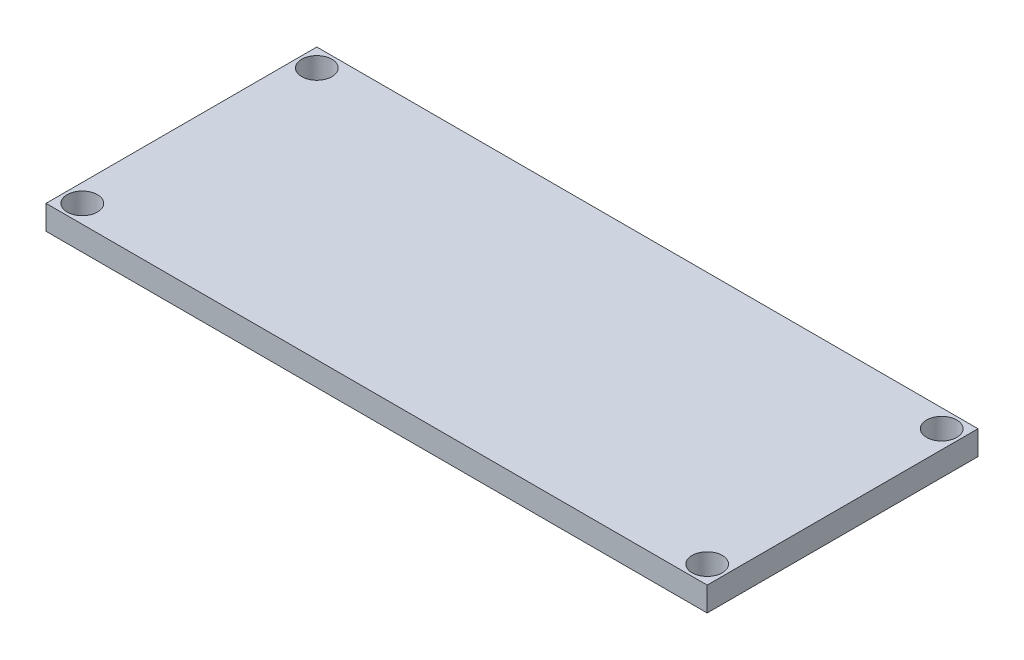
ISO-10303-21;
HEADER;
FILE_DESCRIPTION(('STEP AP214'),'2;1');
FILE_NAME('part.step','',(''),(''),'','','');
FILE_SCHEMA(('AUTOMOTIVE_DESIGN { 1 0 10303 214 1 1 1 1 }'));
ENDSEC;
DATA;
#1=APPLICATION_CONTEXT('core data for automotive mechanical design processes');
#2=APPLICATION_PROTOCOL_DEFINITION('international standard','automotive_design',2000,#1);
#3=PRODUCT_CONTEXT('',#1,'mechanical');
#4=PRODUCT('Part','Part','',(#3));
#5=PRODUCT_RELATED_PRODUCT_CATEGORY('part','',(#4));
#6=PRODUCT_DEFINITION_FORMATION('','',#4);
#7=PRODUCT_DEFINITION_CONTEXT('part definition',#1,'design');
#8=PRODUCT_DEFINITION('design','',#6,#7);
#9=PRODUCT_DEFINITION_SHAPE('','',#8);
#10=(LENGTH_UNIT() NAMED_UNIT(*) SI_UNIT(.MILLI.,.METRE.));
#11=(NAMED_UNIT(*) PLANE_ANGLE_UNIT() SI_UNIT($,.RADIAN.));
#12=(NAMED_UNIT(*) SI_UNIT($,.STERADIAN.) SOLID_ANGLE_UNIT());
#13=UNCERTAINTY_MEASURE_WITH_UNIT(LENGTH_MEASURE(1.E-05),#10,'distance_accuracy_value','');
#14=(GEOMETRIC_REPRESENTATION_CONTEXT(3) GLOBAL_UNCERTAINTY_ASSIGNED_CONTEXT((#13)) GLOBAL_UNIT_ASSIGNED_CONTEXT((#10,
#11,#12)) REPRESENTATION_CONTEXT('',''));
#15=CARTESIAN_POINT('',(0.,0.,0.));
#16=DIRECTION('',(0.,0.,1.));
#17=DIRECTION('',(1.,0.,0.));
#18=AXIS2_PLACEMENT_3D('',#15,#16,#17);
#19=CARTESIAN_POINT('',(21.85,0.,8.95));
#20=DIRECTION('',(0.,1.,0.));
#21=DIRECTION('',(0.,0.,1.));
#22=AXIS2_PLACEMENT_3D('',#19,#20,#21);
#23=PLANE('',#22);
#24=CARTESIAN_POINT('',(1.2,0.,16.7));
#25=DIRECTION('',(0.,1.,0.));
#26=DIRECTION('',(-1.,0.,0.));
#27=AXIS2_PLACEMENT_3D('',#24,#25,#26);
#28=CIRCLE('',#27,0.999999999999996);
#29=CARTESIAN_POINT('',(0.200000000000004,0.,16.7));
#30=VERTEX_POINT('',#29);
#31=EDGE_CURVE('E90',#30,#30,#28,.T.);
#32=ORIENTED_EDGE('',*,*,#31,.T.);
#33=EDGE_LOOP('',(#32));
#34=FACE_BOUND('',#33,.T.);
#35=CARTESIAN_POINT('',(42.5,0.,1.2));
#36=DIRECTION('',(0.,1.,0.));
#37=DIRECTION('',(0.,0.,1.));
#38=AXIS2_PLACEMENT_3D('',#35,#36,#37);
#39=CIRCLE('',#38,0.999999999999996);
#40=CARTESIAN_POINT('',(42.5,0.,2.2));
#41=VERTEX_POINT('',#40);
#42=EDGE_CURVE('E94',#41,#41,#39,.T.);
#43=ORIENTED_EDGE('',*,*,#42,.T.);
#44=EDGE_LOOP('',(#43));
#45=FACE_BOUND('',#44,.T.);
#46=CARTESIAN_POINT('',(42.5,0.,16.7));
#47=DIRECTION('',(0.,-1.,0.));
#48=DIRECTION('',(0.,0.,-1.));
#49=AXIS2_PLACEMENT_3D('',#46,#47,#48);
#50=CIRCLE('',#49,0.999999999999996);
#51=CARTESIAN_POINT('',(42.5,0.,15.7));
#52=VERTEX_POINT('',#51);
#53=EDGE_CURVE('E96',#52,#52,#50,.F.);
#54=ORIENTED_EDGE('',*,*,#53,.T.);
#55=EDGE_LOOP('',(#54));
#56=FACE_BOUND('',#55,.T.);
#57=CARTESIAN_POINT('',(1.2,0.,1.2));
#58=DIRECTION('',(0.,-1.,0.));
#59=DIRECTION('',(1.,0.,0.));
#60=AXIS2_PLACEMENT_3D('',#57,#58,#59);
#61=CIRCLE('',#60,0.999999999999996);
#62=CARTESIAN_POINT('',(2.2,0.,1.2));
#63=VERTEX_POINT('',#62);
#64=EDGE_CURVE('E19',#63,#63,#61,.F.);
#65=ORIENTED_EDGE('',*,*,#64,.T.);
#66=EDGE_LOOP('',(#65));
#67=FACE_BOUND('',#66,.T.);
#68=DIRECTION('',(0.,0.,1.));
#69=VECTOR('',#68,1.);
#70=CARTESIAN_POINT('',(0.,0.,0.));
#71=LINE('',#70,#69);
#72=CARTESIAN_POINT('',(0.,-3.46109497215618E-13,0.));
#73=VERTEX_POINT('',#72);
#74=CARTESIAN_POINT('',(0.,-3.46109497215618E-13,17.9));
#75=VERTEX_POINT('',#74);
#76=EDGE_CURVE('E105',#73,#75,#71,.T.);
#77=ORIENTED_EDGE('',*,*,#76,.F.);
#78=DIRECTION('',(-1.,0.,0.));
#79=VECTOR('',#78,1.);
#80=CARTESIAN_POINT('',(43.7,-1.38443798886247E-12,0.));
#81=LINE('',#80,#79);
#82=CARTESIAN_POINT('',(43.7,-6.92218994431235E-13,0.));
#83=VERTEX_POINT('',#82);
#84=EDGE_CURVE('E54',#83,#73,#81,.T.);
#85=ORIENTED_EDGE('',*,*,#84,.F.);
#86=DIRECTION('',(0.,0.,-1.));
#87=VECTOR('',#86,1.);
#88=CARTESIAN_POINT('',(43.7,-1.38443798886247E-12,17.9));
#89=LINE('',#88,#87);
#90=CARTESIAN_POINT('',(43.7,-6.92218994431235E-13,17.9));
#91=VERTEX_POINT('',#90);
#92=EDGE_CURVE('E56',#91,#83,#89,.T.);
#93=ORIENTED_EDGE('',*,*,#92,.F.);
#94=DIRECTION('',(1.,0.,0.));
#95=VECTOR('',#94,1.);
#96=CARTESIAN_POINT('',(0.,-1.38443798886247E-12,17.9));
#97=LINE('',#96,#95);
#98=EDGE_CURVE('E58',#75,#91,#97,.T.);
#99=ORIENTED_EDGE('',*,*,#98,.F.);
#100=EDGE_LOOP('',(#77,#85,#93,#99));
#101=FACE_BOUND('',#100,.T.);
#102=ADVANCED_FACE('F16',(#34,#45,#56,#67,#101),#23,.F.);
#103=CARTESIAN_POINT('',(0.,-1.38443798886247E-12,17.9));
#104=DIRECTION('',(0.,0.,1.));
#105=DIRECTION('',(1.,0.,0.));
#106=AXIS2_PLACEMENT_3D('',#103,#104,#105);
#107=PLANE('',#106);
#108=DIRECTION('',(1.,0.,0.));
#109=VECTOR('',#108,1.);
#110=CARTESIAN_POINT('',(21.85,1.6,17.9));
#111=LINE('',#110,#109);
#112=CARTESIAN_POINT('',(0.,1.59999999999897,17.9));
#113=VERTEX_POINT('',#112);
#114=CARTESIAN_POINT('',(43.7,1.59999999999897,17.9));
#115=VERTEX_POINT('',#114);
#116=EDGE_CURVE('E93',#113,#115,#111,.T.);
#117=ORIENTED_EDGE('',*,*,#116,.F.);
#118=DIRECTION('',(0.,1.,0.));
#119=VECTOR('',#118,1.);
#120=CARTESIAN_POINT('',(0.,0.,17.9));
#121=LINE('',#120,#119);
#122=EDGE_CURVE('E69',#75,#113,#121,.T.);
#123=ORIENTED_EDGE('',*,*,#122,.F.);
#124=ORIENTED_EDGE('',*,*,#98,.T.);
#125=DIRECTION('',(0.,1.,0.));
#126=VECTOR('',#125,1.);
#127=CARTESIAN_POINT('',(43.7,-1.38443798886247E-12,17.9));
#128=LINE('',#127,#126);
#129=EDGE_CURVE('E63',#115,#91,#128,.F.);
#130=ORIENTED_EDGE('',*,*,#129,.F.);
#131=EDGE_LOOP('',(#117,#123,#124,#130));
#132=FACE_BOUND('',#131,.T.);
#133=ADVANCED_FACE('F66',(#132),#107,.T.);
#134=CARTESIAN_POINT('',(43.7,-1.38443798886247E-12,17.9));
#135=DIRECTION('',(1.,0.,0.));
#136=DIRECTION('',(0.,0.,-1.));
#137=AXIS2_PLACEMENT_3D('',#134,#135,#136);
#138=PLANE('',#137);
#139=DIRECTION('',(0.,0.,1.));
#140=VECTOR('',#139,1.);
#141=CARTESIAN_POINT('',(43.7,1.6,8.95));
#142=LINE('',#141,#140);
#143=CARTESIAN_POINT('',(43.7,1.59999999999931,0.));
#144=VERTEX_POINT('',#143);
#145=EDGE_CURVE('E74',#115,#144,#142,.F.);
#146=ORIENTED_EDGE('',*,*,#145,.F.);
#147=ORIENTED_EDGE('',*,*,#129,.T.);
#148=ORIENTED_EDGE('',*,*,#92,.T.);
#149=DIRECTION('',(0.,1.,0.));
#150=VECTOR('',#149,1.);
#151=CARTESIAN_POINT('',(43.7,-1.38443798886247E-12,0.));
#152=LINE('',#151,#150);
#153=EDGE_CURVE('E77',#144,#83,#152,.F.);
#154=ORIENTED_EDGE('',*,*,#153,.F.);
#155=EDGE_LOOP('',(#146,#147,#148,#154));
#156=FACE_BOUND('',#155,.T.);
#157=ADVANCED_FACE('F72',(#156),#138,.T.);
#158=CARTESIAN_POINT('',(43.7,-1.38443798886247E-12,0.));
#159=DIRECTION('',(0.,0.,-1.));
#160=DIRECTION('',(-1.,0.,0.));
#161=AXIS2_PLACEMENT_3D('',#158,#159,#160);
#162=PLANE('',#161);
#163=DIRECTION('',(1.,0.,0.));
#164=VECTOR('',#163,1.);
#165=CARTESIAN_POINT('',(21.85,1.6,0.));
#166=LINE('',#165,#164);
#167=CARTESIAN_POINT('',(0.,1.59999999999966,0.));
#168=VERTEX_POINT('',#167);
#169=EDGE_CURVE('E112',#144,#168,#166,.F.);
#170=ORIENTED_EDGE('',*,*,#169,.F.);
#171=ORIENTED_EDGE('',*,*,#153,.T.);
#172=ORIENTED_EDGE('',*,*,#84,.T.);
#173=DIRECTION('',(0.,1.,0.));
#174=VECTOR('',#173,1.);
#175=CARTESIAN_POINT('',(0.,0.,0.));
#176=LINE('',#175,#174);
#177=EDGE_CURVE('E34',#168,#73,#176,.F.);
#178=ORIENTED_EDGE('',*,*,#177,.F.);
#179=EDGE_LOOP('',(#170,#171,#172,#178));
#180=FACE_BOUND('',#179,.T.);
#181=ADVANCED_FACE('F110',(#180),#162,.T.);
#182=CARTESIAN_POINT('',(0.,0.,0.));
#183=DIRECTION('',(-1.,0.,0.));
#184=DIRECTION('',(0.,0.,1.));
#185=AXIS2_PLACEMENT_3D('',#182,#183,#184);
#186=PLANE('',#185);
#187=DIRECTION('',(0.,0.,1.));
#188=VECTOR('',#187,1.);
#189=CARTESIAN_POINT('',(0.,1.6,8.95));
#190=LINE('',#189,#188);
#191=EDGE_CURVE('E89',#168,#113,#190,.T.);
#192=ORIENTED_EDGE('',*,*,#191,.F.);
#193=ORIENTED_EDGE('',*,*,#177,.T.);
#194=ORIENTED_EDGE('',*,*,#76,.T.);
#195=ORIENTED_EDGE('',*,*,#122,.T.);
#196=EDGE_LOOP('',(#192,#193,#194,#195));
#197=FACE_BOUND('',#196,.T.);
#198=ADVANCED_FACE('F118',(#197),#186,.T.);
#199=CARTESIAN_POINT('',(1.2,0.,1.2));
#200=DIRECTION('',(0.,-1.,0.));
#201=DIRECTION('',(1.,0.,0.));
#202=AXIS2_PLACEMENT_3D('',#199,#200,#201);
#203=CYLINDRICAL_SURFACE('',#202,0.999999999999996);
#204=ORIENTED_EDGE('',*,*,#64,.F.);
#205=EDGE_LOOP('',(#204));
#206=FACE_BOUND('',#205,.T.);
#207=CARTESIAN_POINT('',(1.2,1.6,1.2));
#208=DIRECTION('',(0.,-1.,0.));
#209=DIRECTION('',(1.,0.,0.));
#210=AXIS2_PLACEMENT_3D('',#207,#208,#209);
#211=CIRCLE('',#210,0.999999999999996);
#212=CARTESIAN_POINT('',(2.2,1.6,1.2));
#213=VERTEX_POINT('',#212);
#214=EDGE_CURVE('E86',#213,#213,#211,.T.);
#215=ORIENTED_EDGE('',*,*,#214,.F.);
#216=EDGE_LOOP('',(#215));
#217=FACE_BOUND('',#216,.T.);
#218=ADVANCED_FACE('F120',(#206,#217),#203,.F.);
#219=CARTESIAN_POINT('',(42.5,0.,16.7));
#220=DIRECTION('',(0.,-1.,0.));
#221=DIRECTION('',(0.,0.,-1.));
#222=AXIS2_PLACEMENT_3D('',#219,#220,#221);
#223=CYLINDRICAL_SURFACE('',#222,0.999999999999996);
#224=ORIENTED_EDGE('',*,*,#53,.F.);
#225=EDGE_LOOP('',(#224));
#226=FACE_BOUND('',#225,.T.);
#227=CARTESIAN_POINT('',(42.5,1.6,16.7));
#228=DIRECTION('',(0.,-1.,0.));
#229=DIRECTION('',(0.,0.,-1.));
#230=AXIS2_PLACEMENT_3D('',#227,#228,#229);
#231=CIRCLE('',#230,0.999999999999996);
#232=CARTESIAN_POINT('',(42.5,1.6,15.7));
#233=VERTEX_POINT('',#232);
#234=EDGE_CURVE('E83',#233,#233,#231,.T.);
#235=ORIENTED_EDGE('',*,*,#234,.F.);
#236=EDGE_LOOP('',(#235));
#237=FACE_BOUND('',#236,.T.);
#238=ADVANCED_FACE('F127',(#226,#237),#223,.F.);
#239=CARTESIAN_POINT('',(42.5,0.,1.2));
#240=DIRECTION('',(0.,1.,0.));
#241=DIRECTION('',(0.,0.,1.));
#242=AXIS2_PLACEMENT_3D('',#239,#240,#241);
#243=CYLINDRICAL_SURFACE('',#242,0.999999999999996);
#244=ORIENTED_EDGE('',*,*,#42,.F.);
#245=EDGE_LOOP('',(#244));
#246=FACE_BOUND('',#245,.T.);
#247=CARTESIAN_POINT('',(42.5,1.6,1.2));
#248=DIRECTION('',(0.,1.,0.));
#249=DIRECTION('',(0.,0.,1.));
#250=AXIS2_PLACEMENT_3D('',#247,#248,#249);
#251=CIRCLE('',#250,0.999999999999996);
#252=CARTESIAN_POINT('',(42.5,1.6,2.2));
#253=VERTEX_POINT('',#252);
#254=EDGE_CURVE('E25',#253,#253,#251,.F.);
#255=ORIENTED_EDGE('',*,*,#254,.F.);
#256=EDGE_LOOP('',(#255));
#257=FACE_BOUND('',#256,.T.);
#258=ADVANCED_FACE('F138',(#246,#257),#243,.F.);
#259=CARTESIAN_POINT('',(1.2,0.,16.7));
#260=DIRECTION('',(0.,1.,0.));
#261=DIRECTION('',(-1.,0.,0.));
#262=AXIS2_PLACEMENT_3D('',#259,#260,#261);
#263=CYLINDRICAL_SURFACE('',#262,0.999999999999996);
#264=ORIENTED_EDGE('',*,*,#31,.F.);
#265=EDGE_LOOP('',(#264));
#266=FACE_BOUND('',#265,.T.);
#267=CARTESIAN_POINT('',(1.2,1.6,16.7));
#268=DIRECTION('',(0.,1.,0.));
#269=DIRECTION('',(-1.,0.,0.));
#270=AXIS2_PLACEMENT_3D('',#267,#268,#269);
#271=CIRCLE('',#270,0.999999999999996);
#272=CARTESIAN_POINT('',(0.200000000000004,1.6,16.7));
#273=VERTEX_POINT('',#272);
#274=EDGE_CURVE('E11',#273,#273,#271,.F.);
#275=ORIENTED_EDGE('',*,*,#274,.F.);
#276=EDGE_LOOP('',(#275));
#277=FACE_BOUND('',#276,.T.);
#278=ADVANCED_FACE('F132',(#266,#277),#263,.F.);
#279=CARTESIAN_POINT('',(21.85,1.6,8.95));
#280=DIRECTION('',(0.,1.,0.));
#281=DIRECTION('',(0.,0.,1.));
#282=AXIS2_PLACEMENT_3D('',#279,#280,#281);
#283=PLANE('',#282);
#284=ORIENTED_EDGE('',*,*,#274,.T.);
#285=EDGE_LOOP('',(#284));
#286=FACE_BOUND('',#285,.T.);
#287=ORIENTED_EDGE('',*,*,#254,.T.);
#288=EDGE_LOOP('',(#287));
#289=FACE_BOUND('',#288,.T.);
#290=ORIENTED_EDGE('',*,*,#234,.T.);
#291=EDGE_LOOP('',(#290));
#292=FACE_BOUND('',#291,.T.);
#293=ORIENTED_EDGE('',*,*,#214,.T.);
#294=EDGE_LOOP('',(#293));
#295=FACE_BOUND('',#294,.T.);
#296=ORIENTED_EDGE('',*,*,#169,.T.);
#297=ORIENTED_EDGE('',*,*,#191,.T.);
#298=ORIENTED_EDGE('',*,*,#116,.T.);
#299=ORIENTED_EDGE('',*,*,#145,.T.);
#300=EDGE_LOOP('',(#296,#297,#298,#299));
#301=FACE_BOUND('',#300,.T.);
#302=ADVANCED_FACE('F116',(#286,#289,#292,#295,#301),#283,.T.);
#303=CLOSED_SHELL('',(#102,#133,#157,#181,#198,#218,#238,#258,#278,#302));
#304=MANIFOLD_SOLID_BREP('B1',#303);
#305=ADVANCED_BREP_SHAPE_REPRESENTATION('',(#18,#304),#14);
#306=SHAPE_DEFINITION_REPRESENTATION(#9,#305);
ENDSEC;
END-ISO-10303-21;
